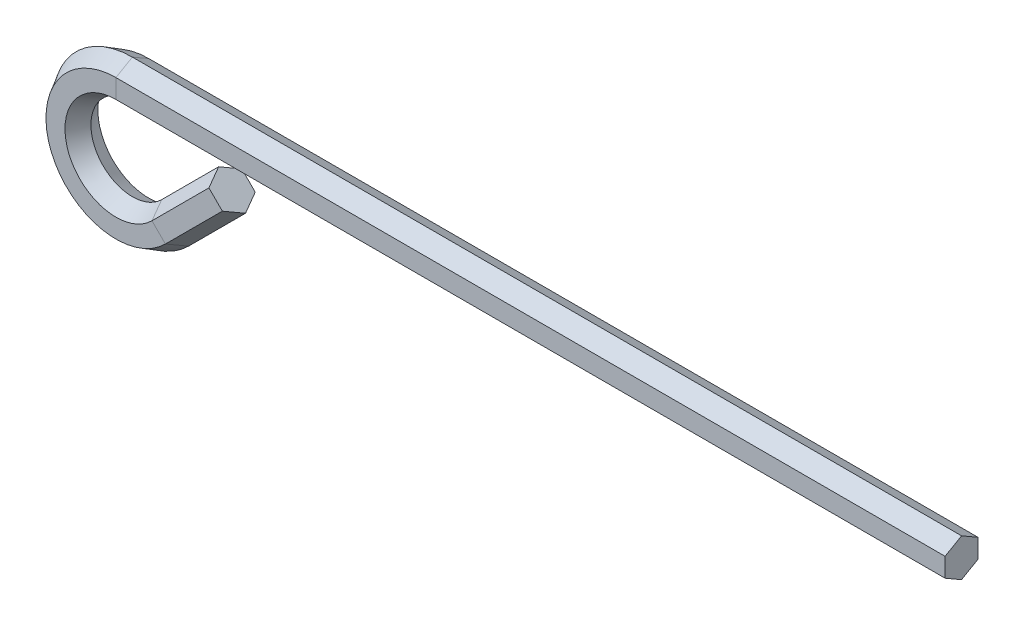
ISO-10303-21;
HEADER;
FILE_DESCRIPTION(('STEP AP214'),'2;1');
FILE_NAME('part.step','',(''),(''),'','','');
FILE_SCHEMA(('AUTOMOTIVE_DESIGN { 1 0 10303 214 1 1 1 1 }'));
ENDSEC;
DATA;
#1=APPLICATION_CONTEXT('core data for automotive mechanical design processes');
#2=APPLICATION_PROTOCOL_DEFINITION('international standard','automotive_design',2000,#1);
#3=PRODUCT_CONTEXT('',#1,'mechanical');
#4=PRODUCT('Part','Part','',(#3));
#5=PRODUCT_RELATED_PRODUCT_CATEGORY('part','',(#4));
#6=PRODUCT_DEFINITION_FORMATION('','',#4);
#7=PRODUCT_DEFINITION_CONTEXT('part definition',#1,'design');
#8=PRODUCT_DEFINITION('design','',#6,#7);
#9=PRODUCT_DEFINITION_SHAPE('','',#8);
#10=(LENGTH_UNIT() NAMED_UNIT(*) SI_UNIT(.MILLI.,.METRE.));
#11=(NAMED_UNIT(*) PLANE_ANGLE_UNIT() SI_UNIT($,.RADIAN.));
#12=(NAMED_UNIT(*) SI_UNIT($,.STERADIAN.) SOLID_ANGLE_UNIT());
#13=UNCERTAINTY_MEASURE_WITH_UNIT(LENGTH_MEASURE(1.E-05),#10,'distance_accuracy_value','');
#14=(GEOMETRIC_REPRESENTATION_CONTEXT(3) GLOBAL_UNCERTAINTY_ASSIGNED_CONTEXT((#13)) GLOBAL_UNIT_ASSIGNED_CONTEXT((#10,
#11,#12)) REPRESENTATION_CONTEXT('',''));
#15=CARTESIAN_POINT('',(0.,0.,0.));
#16=DIRECTION('',(0.,0.,1.));
#17=DIRECTION('',(1.,0.,0.));
#18=AXIS2_PLACEMENT_3D('',#15,#16,#17);
#19=CARTESIAN_POINT('',(4.12132034355962,4.12132034355964,0.));
#20=DIRECTION('',(-0.707106781186546,-0.707106781186549,0.));
#21=DIRECTION('',(0.,0.,-1.));
#22=AXIS2_PLACEMENT_3D('',#19,#20,#21);
#23=PLANE('',#22);
#24=DIRECTION('',(-0.353553390593274,0.353553390593273,-0.866025403784439));
#25=VECTOR('',#24,1.);
#26=CARTESIAN_POINT('',(6.7286602769165,1.51398041020278,1.1905));
#27=LINE('',#26,#25);
#28=CARTESIAN_POINT('',(6.7286602769165,1.51398041020278,1.1905));
#29=VERTEX_POINT('',#28);
#30=CARTESIAN_POINT('',(6.24264068711927,2.,0.));
#31=VERTEX_POINT('',#30);
#32=EDGE_CURVE('E192',#29,#31,#27,.T.);
#33=ORIENTED_EDGE('',*,*,#32,.F.);
#34=DIRECTION('',(-0.707106781186549,0.707106781186546,0.));
#35=VECTOR('',#34,1.);
#36=CARTESIAN_POINT('',(7.70069945651096,0.541941230608321,1.1905));
#37=LINE('',#36,#35);
#38=CARTESIAN_POINT('',(7.70069945651096,0.541941230608321,1.1905));
#39=VERTEX_POINT('',#38);
#40=EDGE_CURVE('E234',#39,#29,#37,.T.);
#41=ORIENTED_EDGE('',*,*,#40,.F.);
#42=DIRECTION('',(-0.353553390593275,0.353553390593273,0.866025403784438));
#43=VECTOR('',#42,1.);
#44=CARTESIAN_POINT('',(8.18671904630819,0.0559216408110921,0.));
#45=LINE('',#44,#43);
#46=CARTESIAN_POINT('',(8.18671904630819,0.0559216408110921,0.));
#47=VERTEX_POINT('',#46);
#48=EDGE_CURVE('E221',#47,#39,#45,.T.);
#49=ORIENTED_EDGE('',*,*,#48,.F.);
#50=DIRECTION('',(0.353553390593275,-0.353553390593273,0.866025403784439));
#51=VECTOR('',#50,1.);
#52=CARTESIAN_POINT('',(7.70069945651096,0.541941230608321,-1.1905));
#53=LINE('',#52,#51);
#54=CARTESIAN_POINT('',(7.70069945651096,0.541941230608321,-1.1905));
#55=VERTEX_POINT('',#54);
#56=EDGE_CURVE('E144',#55,#47,#53,.T.);
#57=ORIENTED_EDGE('',*,*,#56,.F.);
#58=DIRECTION('',(0.707106781186549,-0.707106781186546,0.));
#59=VECTOR('',#58,1.);
#60=CARTESIAN_POINT('',(6.7286602769165,1.51398041020277,-1.1905));
#61=LINE('',#60,#59);
#62=CARTESIAN_POINT('',(6.7286602769165,1.51398041020277,-1.1905));
#63=VERTEX_POINT('',#62);
#64=EDGE_CURVE('E148',#63,#55,#61,.T.);
#65=ORIENTED_EDGE('',*,*,#64,.F.);
#66=DIRECTION('',(0.353553390593275,-0.353553390593274,-0.866025403784438));
#67=VECTOR('',#66,1.);
#68=CARTESIAN_POINT('',(6.24264068711927,2.,0.));
#69=LINE('',#68,#67);
#70=EDGE_CURVE('E153',#31,#63,#69,.T.);
#71=ORIENTED_EDGE('',*,*,#70,.F.);
#72=EDGE_LOOP('',(#33,#41,#49,#57,#65,#71));
#73=FACE_BOUND('',#72,.T.);
#74=ADVANCED_FACE('F43',(#73),#23,.F.);
#75=CARTESIAN_POINT('',(60.,0.,0.));
#76=DIRECTION('',(1.,0.,0.));
#77=DIRECTION('',(0.,0.,-1.));
#78=AXIS2_PLACEMENT_3D('',#75,#76,#77);
#79=PLANE('',#78);
#80=DIRECTION('',(0.,-0.5,-0.866025403784439));
#81=VECTOR('',#80,1.);
#82=CARTESIAN_POINT('',(60.,3.68733549547025,1.1905));
#83=LINE('',#82,#81);
#84=CARTESIAN_POINT('',(60.,3.68733549547025,1.1905));
#85=VERTEX_POINT('',#84);
#86=CARTESIAN_POINT('',(60.,3.,0.));
#87=VERTEX_POINT('',#86);
#88=EDGE_CURVE('E164',#85,#87,#83,.T.);
#89=ORIENTED_EDGE('',*,*,#88,.T.);
#90=DIRECTION('',(0.,0.500000000000001,-0.866025403784438));
#91=VECTOR('',#90,1.);
#92=CARTESIAN_POINT('',(60.,3.,0.));
#93=LINE('',#92,#91);
#94=CARTESIAN_POINT('',(60.,3.68733549547025,-1.1905));
#95=VERTEX_POINT('',#94);
#96=EDGE_CURVE('E167',#87,#95,#93,.T.);
#97=ORIENTED_EDGE('',*,*,#96,.T.);
#98=DIRECTION('',(0.,1.,0.));
#99=VECTOR('',#98,1.);
#100=CARTESIAN_POINT('',(60.,3.68733549547025,-1.1905));
#101=LINE('',#100,#99);
#102=CARTESIAN_POINT('',(60.,5.06200648641075,-1.1905));
#103=VERTEX_POINT('',#102);
#104=EDGE_CURVE('E207',#95,#103,#101,.T.);
#105=ORIENTED_EDGE('',*,*,#104,.T.);
#106=DIRECTION('',(0.,0.5,0.866025403784439));
#107=VECTOR('',#106,1.);
#108=CARTESIAN_POINT('',(60.,5.06200648641075,-1.1905));
#109=LINE('',#108,#107);
#110=CARTESIAN_POINT('',(60.,5.749341981881,0.));
#111=VERTEX_POINT('',#110);
#112=EDGE_CURVE('E62',#103,#111,#109,.T.);
#113=ORIENTED_EDGE('',*,*,#112,.T.);
#114=DIRECTION('',(0.,-0.5,0.866025403784438));
#115=VECTOR('',#114,1.);
#116=CARTESIAN_POINT('',(60.,5.749341981881,0.));
#117=LINE('',#116,#115);
#118=CARTESIAN_POINT('',(60.,5.06200648641075,1.1905));
#119=VERTEX_POINT('',#118);
#120=EDGE_CURVE('E56',#111,#119,#117,.T.);
#121=ORIENTED_EDGE('',*,*,#120,.T.);
#122=DIRECTION('',(0.,-1.,0.));
#123=VECTOR('',#122,1.);
#124=CARTESIAN_POINT('',(60.,5.06200648641075,1.1905));
#125=LINE('',#124,#123);
#126=EDGE_CURVE('E11',#119,#85,#125,.T.);
#127=ORIENTED_EDGE('',*,*,#126,.T.);
#128=EDGE_LOOP('',(#89,#97,#105,#113,#121,#127));
#129=FACE_BOUND('',#128,.T.);
#130=ADVANCED_FACE('F166',(#129),#79,.T.);
#131=CARTESIAN_POINT('',(6.7286602769165,1.51398041020278,1.1905));
#132=DIRECTION('',(-0.612372435695796,0.612372435695794,0.5));
#133=DIRECTION('',(-0.707106781186546,-0.707106781186549,0.));
#134=AXIS2_PLACEMENT_3D('',#131,#132,#133);
#135=PLANE('',#134);
#136=DIRECTION('',(-0.707106781186546,-0.707106781186549,0.));
#137=VECTOR('',#136,1.);
#138=CARTESIAN_POINT('',(6.24264068711927,2.,0.));
#139=LINE('',#138,#137);
#140=CARTESIAN_POINT('',(2.12132034355965,-2.12132034355964,0.));
#141=VERTEX_POINT('',#140);
#142=EDGE_CURVE('E197',#31,#141,#139,.T.);
#143=ORIENTED_EDGE('',*,*,#142,.T.);
#144=DIRECTION('',(-0.353553390593274,0.353553390593273,-0.866025403784439));
#145=VECTOR('',#144,1.);
#146=CARTESIAN_POINT('',(2.60733993335688,-2.60733993335686,1.1905));
#147=LINE('',#146,#145);
#148=CARTESIAN_POINT('',(2.60733993335688,-2.60733993335686,1.1905));
#149=VERTEX_POINT('',#148);
#150=EDGE_CURVE('E266',#149,#141,#147,.T.);
#151=ORIENTED_EDGE('',*,*,#150,.F.);
#152=DIRECTION('',(-0.707106781186546,-0.707106781186549,0.));
#153=VECTOR('',#152,1.);
#154=CARTESIAN_POINT('',(6.7286602769165,1.51398041020278,1.1905));
#155=LINE('',#154,#153);
#156=EDGE_CURVE('E248',#29,#149,#155,.T.);
#157=ORIENTED_EDGE('',*,*,#156,.F.);
#158=ORIENTED_EDGE('',*,*,#32,.T.);
#159=EDGE_LOOP('',(#143,#151,#157,#158));
#160=FACE_BOUND('',#159,.T.);
#161=ADVANCED_FACE('F273',(#160),#135,.T.);
#162=CARTESIAN_POINT('',(6.24264068711927,2.,0.));
#163=DIRECTION('',(-0.612372435695795,0.612372435695793,-0.5));
#164=DIRECTION('',(-0.707106781186546,-0.707106781186549,0.));
#165=AXIS2_PLACEMENT_3D('',#162,#163,#164);
#166=PLANE('',#165);
#167=DIRECTION('',(-0.707106781186546,-0.707106781186549,0.));
#168=VECTOR('',#167,1.);
#169=CARTESIAN_POINT('',(6.7286602769165,1.51398041020277,-1.1905));
#170=LINE('',#169,#168);
#171=CARTESIAN_POINT('',(2.60733993335688,-2.60733993335687,-1.1905));
#172=VERTEX_POINT('',#171);
#173=EDGE_CURVE('E196',#63,#172,#170,.T.);
#174=ORIENTED_EDGE('',*,*,#173,.T.);
#175=DIRECTION('',(0.353553390593275,-0.353553390593274,-0.866025403784438));
#176=VECTOR('',#175,1.);
#177=CARTESIAN_POINT('',(2.12132034355965,-2.12132034355963,0.));
#178=LINE('',#177,#176);
#179=EDGE_CURVE('E193',#141,#172,#178,.T.);
#180=ORIENTED_EDGE('',*,*,#179,.F.);
#181=ORIENTED_EDGE('',*,*,#142,.F.);
#182=ORIENTED_EDGE('',*,*,#70,.T.);
#183=EDGE_LOOP('',(#174,#180,#181,#182));
#184=FACE_BOUND('',#183,.T.);
#185=ADVANCED_FACE('F276',(#184),#166,.T.);
#186=CARTESIAN_POINT('',(6.7286602769165,1.51398041020277,-1.1905));
#187=DIRECTION('',(0.,0.,-1.));
#188=DIRECTION('',(-1.,0.,0.));
#189=AXIS2_PLACEMENT_3D('',#186,#187,#188);
#190=PLANE('',#189);
#191=DIRECTION('',(-0.707106781186546,-0.707106781186549,0.));
#192=VECTOR('',#191,1.);
#193=CARTESIAN_POINT('',(7.70069945651096,0.541941230608321,-1.1905));
#194=LINE('',#193,#192);
#195=CARTESIAN_POINT('',(3.57937911295134,-3.57937911295132,-1.1905));
#196=VERTEX_POINT('',#195);
#197=EDGE_CURVE('E210',#55,#196,#194,.T.);
#198=ORIENTED_EDGE('',*,*,#197,.T.);
#199=DIRECTION('',(0.707106781186549,-0.707106781186546,0.));
#200=VECTOR('',#199,1.);
#201=CARTESIAN_POINT('',(2.60733993335688,-2.60733993335686,-1.1905));
#202=LINE('',#201,#200);
#203=EDGE_CURVE('E200',#172,#196,#202,.T.);
#204=ORIENTED_EDGE('',*,*,#203,.F.);
#205=ORIENTED_EDGE('',*,*,#173,.F.);
#206=ORIENTED_EDGE('',*,*,#64,.T.);
#207=EDGE_LOOP('',(#198,#204,#205,#206));
#208=FACE_BOUND('',#207,.T.);
#209=ADVANCED_FACE('F333',(#208),#190,.T.);
#210=CARTESIAN_POINT('',(7.70069945651096,0.541941230608321,-1.1905));
#211=DIRECTION('',(0.612372435695795,-0.612372435695793,-0.5));
#212=DIRECTION('',(0.707106781186546,0.707106781186549,0.));
#213=AXIS2_PLACEMENT_3D('',#210,#211,#212);
#214=PLANE('',#213);
#215=DIRECTION('',(-0.707106781186546,-0.707106781186549,0.));
#216=VECTOR('',#215,1.);
#217=CARTESIAN_POINT('',(8.18671904630819,0.0559216408110921,0.));
#218=LINE('',#217,#216);
#219=CARTESIAN_POINT('',(4.06539870274857,-4.06539870274855,0.));
#220=VERTEX_POINT('',#219);
#221=EDGE_CURVE('E223',#47,#220,#218,.T.);
#222=ORIENTED_EDGE('',*,*,#221,.T.);
#223=DIRECTION('',(0.353553390593275,-0.353553390593273,0.866025403784439));
#224=VECTOR('',#223,1.);
#225=CARTESIAN_POINT('',(3.57937911295134,-3.57937911295132,-1.1905));
#226=LINE('',#225,#224);
#227=EDGE_CURVE('E213',#196,#220,#226,.T.);
#228=ORIENTED_EDGE('',*,*,#227,.F.);
#229=ORIENTED_EDGE('',*,*,#197,.F.);
#230=ORIENTED_EDGE('',*,*,#56,.T.);
#231=EDGE_LOOP('',(#222,#228,#229,#230));
#232=FACE_BOUND('',#231,.T.);
#233=ADVANCED_FACE('F342',(#232),#214,.T.);
#234=CARTESIAN_POINT('',(8.18671904630819,0.0559216408110921,0.));
#235=DIRECTION('',(0.612372435695795,-0.612372435695793,0.5));
#236=DIRECTION('',(0.707106781186546,0.707106781186549,0.));
#237=AXIS2_PLACEMENT_3D('',#234,#235,#236);
#238=PLANE('',#237);
#239=DIRECTION('',(-0.707106781186546,-0.707106781186549,0.));
#240=VECTOR('',#239,1.);
#241=CARTESIAN_POINT('',(7.70069945651096,0.541941230608321,1.1905));
#242=LINE('',#241,#240);
#243=CARTESIAN_POINT('',(3.57937911295134,-3.57937911295132,1.1905));
#244=VERTEX_POINT('',#243);
#245=EDGE_CURVE('E236',#39,#244,#242,.T.);
#246=ORIENTED_EDGE('',*,*,#245,.T.);
#247=DIRECTION('',(-0.353553390593275,0.353553390593273,0.866025403784438));
#248=VECTOR('',#247,1.);
#249=CARTESIAN_POINT('',(4.06539870274857,-4.06539870274854,0.));
#250=LINE('',#249,#248);
#251=EDGE_CURVE('E226',#220,#244,#250,.T.);
#252=ORIENTED_EDGE('',*,*,#251,.F.);
#253=ORIENTED_EDGE('',*,*,#221,.F.);
#254=ORIENTED_EDGE('',*,*,#48,.T.);
#255=EDGE_LOOP('',(#246,#252,#253,#254));
#256=FACE_BOUND('',#255,.T.);
#257=ADVANCED_FACE('F353',(#256),#238,.T.);
#258=CARTESIAN_POINT('',(7.70069945651096,0.541941230608321,1.1905));
#259=DIRECTION('',(0.,0.,1.));
#260=DIRECTION('',(1.,0.,0.));
#261=AXIS2_PLACEMENT_3D('',#258,#259,#260);
#262=PLANE('',#261);
#263=DIRECTION('',(-0.707106781186549,0.707106781186546,0.));
#264=VECTOR('',#263,1.);
#265=CARTESIAN_POINT('',(3.57937911295134,-3.57937911295132,1.1905));
#266=LINE('',#265,#264);
#267=EDGE_CURVE('E239',#244,#149,#266,.T.);
#268=ORIENTED_EDGE('',*,*,#267,.F.);
#269=ORIENTED_EDGE('',*,*,#245,.F.);
#270=ORIENTED_EDGE('',*,*,#40,.T.);
#271=ORIENTED_EDGE('',*,*,#156,.T.);
#272=EDGE_LOOP('',(#268,#269,#270,#271));
#273=FACE_BOUND('',#272,.T.);
#274=ADVANCED_FACE('F289',(#273),#262,.T.);
#275=CARTESIAN_POINT('',(0.,0.,1.1905));
#276=DIRECTION('',(0.,0.,1.));
#277=DIRECTION('',(1.,0.,0.));
#278=AXIS2_PLACEMENT_3D('',#275,#276,#277);
#279=CONICAL_SURFACE('',#278,3.68733549547025,0.523598775598298);
#280=CARTESIAN_POINT('',(0.,0.,0.));
#281=DIRECTION('',(0.,0.,-1.));
#282=DIRECTION('',(0.707106781186549,-0.707106781186546,0.));
#283=AXIS2_PLACEMENT_3D('',#280,#281,#282);
#284=CIRCLE('',#283,3.);
#285=CARTESIAN_POINT('',(0.,3.,0.));
#286=VERTEX_POINT('',#285);
#287=EDGE_CURVE('E203',#141,#286,#284,.T.);
#288=ORIENTED_EDGE('',*,*,#287,.T.);
#289=DIRECTION('',(0.,-0.5,-0.866025403784439));
#290=VECTOR('',#289,1.);
#291=CARTESIAN_POINT('',(0.,3.68733549547024,1.1905));
#292=LINE('',#291,#290);
#293=CARTESIAN_POINT('',(0.,3.68733549547025,1.1905));
#294=VERTEX_POINT('',#293);
#295=EDGE_CURVE('E185',#294,#286,#292,.T.);
#296=ORIENTED_EDGE('',*,*,#295,.F.);
#297=CARTESIAN_POINT('',(0.,0.,1.1905));
#298=DIRECTION('',(0.,0.,-1.));
#299=DIRECTION('',(0.707106781186549,-0.707106781186546,0.));
#300=AXIS2_PLACEMENT_3D('',#297,#298,#299);
#301=CIRCLE('',#300,3.68733549547025);
#302=EDGE_CURVE('E250',#149,#294,#301,.T.);
#303=ORIENTED_EDGE('',*,*,#302,.F.);
#304=ORIENTED_EDGE('',*,*,#150,.T.);
#305=EDGE_LOOP('',(#288,#296,#303,#304));
#306=FACE_BOUND('',#305,.T.);
#307=ADVANCED_FACE('F256',(#306),#279,.F.);
#308=CARTESIAN_POINT('',(0.,0.,0.));
#309=DIRECTION('',(0.,0.,-1.));
#310=DIRECTION('',(-1.,0.,0.));
#311=AXIS2_PLACEMENT_3D('',#308,#309,#310);
#312=CONICAL_SURFACE('',#311,3.,0.523598775598299);
#313=CARTESIAN_POINT('',(0.,0.,-1.1905));
#314=DIRECTION('',(0.,0.,-1.));
#315=DIRECTION('',(0.707106781186549,-0.707106781186546,0.));
#316=AXIS2_PLACEMENT_3D('',#313,#314,#315);
#317=CIRCLE('',#316,3.68733549547025);
#318=CARTESIAN_POINT('',(0.,3.68733549547025,-1.1905));
#319=VERTEX_POINT('',#318);
#320=EDGE_CURVE('E131',#172,#319,#317,.T.);
#321=ORIENTED_EDGE('',*,*,#320,.T.);
#322=DIRECTION('',(0.,0.500000000000001,-0.866025403784438));
#323=VECTOR('',#322,1.);
#324=CARTESIAN_POINT('',(0.,2.99999999999999,0.));
#325=LINE('',#324,#323);
#326=EDGE_CURVE('E201',#286,#319,#325,.T.);
#327=ORIENTED_EDGE('',*,*,#326,.F.);
#328=ORIENTED_EDGE('',*,*,#287,.F.);
#329=ORIENTED_EDGE('',*,*,#179,.T.);
#330=EDGE_LOOP('',(#321,#327,#328,#329));
#331=FACE_BOUND('',#330,.T.);
#332=ADVANCED_FACE('F279',(#331),#312,.F.);
#333=CARTESIAN_POINT('',(2.60733993335688,-2.60733993335686,-1.1905));
#334=DIRECTION('',(0.,0.,-1.));
#335=DIRECTION('',(-1.,0.,0.));
#336=AXIS2_PLACEMENT_3D('',#333,#334,#335);
#337=PLANE('',#336);
#338=CARTESIAN_POINT('',(0.,0.,-1.1905));
#339=DIRECTION('',(0.,0.,-1.));
#340=DIRECTION('',(0.707106781186549,-0.707106781186546,0.));
#341=AXIS2_PLACEMENT_3D('',#338,#339,#340);
#342=CIRCLE('',#341,5.06200648641075);
#343=CARTESIAN_POINT('',(0.,5.06200648641075,-1.1905));
#344=VERTEX_POINT('',#343);
#345=EDGE_CURVE('E122',#196,#344,#342,.T.);
#346=ORIENTED_EDGE('',*,*,#345,.T.);
#347=DIRECTION('',(0.,1.,0.));
#348=VECTOR('',#347,1.);
#349=CARTESIAN_POINT('',(0.,3.68733549547024,-1.1905));
#350=LINE('',#349,#348);
#351=EDGE_CURVE('E204',#319,#344,#350,.T.);
#352=ORIENTED_EDGE('',*,*,#351,.F.);
#353=ORIENTED_EDGE('',*,*,#320,.F.);
#354=ORIENTED_EDGE('',*,*,#203,.T.);
#355=EDGE_LOOP('',(#346,#352,#353,#354));
#356=FACE_BOUND('',#355,.T.);
#357=ADVANCED_FACE('F281',(#356),#337,.T.);
#358=CARTESIAN_POINT('',(0.,0.,-1.1905));
#359=DIRECTION('',(0.,0.,1.));
#360=DIRECTION('',(1.,0.,0.));
#361=AXIS2_PLACEMENT_3D('',#358,#359,#360);
#362=CONICAL_SURFACE('',#361,5.06200648641075,0.523598775598299);
#363=CARTESIAN_POINT('',(0.,0.,0.));
#364=DIRECTION('',(0.,0.,-1.));
#365=DIRECTION('',(0.707106781186549,-0.707106781186546,0.));
#366=AXIS2_PLACEMENT_3D('',#363,#364,#365);
#367=CIRCLE('',#366,5.749341981881);
#368=CARTESIAN_POINT('',(0.,5.749341981881,0.));
#369=VERTEX_POINT('',#368);
#370=EDGE_CURVE('E115',#220,#369,#367,.T.);
#371=ORIENTED_EDGE('',*,*,#370,.T.);
#372=DIRECTION('',(0.,0.5,0.866025403784439));
#373=VECTOR('',#372,1.);
#374=CARTESIAN_POINT('',(0.,5.06200648641074,-1.1905));
#375=LINE('',#374,#373);
#376=EDGE_CURVE('E217',#344,#369,#375,.T.);
#377=ORIENTED_EDGE('',*,*,#376,.F.);
#378=ORIENTED_EDGE('',*,*,#345,.F.);
#379=ORIENTED_EDGE('',*,*,#227,.T.);
#380=EDGE_LOOP('',(#371,#377,#378,#379));
#381=FACE_BOUND('',#380,.T.);
#382=ADVANCED_FACE('F287',(#381),#362,.T.);
#383=CARTESIAN_POINT('',(0.,0.,0.));
#384=DIRECTION('',(0.,0.,-1.));
#385=DIRECTION('',(-1.,0.,0.));
#386=AXIS2_PLACEMENT_3D('',#383,#384,#385);
#387=CONICAL_SURFACE('',#386,5.749341981881,0.523598775598299);
#388=CARTESIAN_POINT('',(0.,0.,1.1905));
#389=DIRECTION('',(0.,0.,-1.));
#390=DIRECTION('',(0.707106781186549,-0.707106781186546,0.));
#391=AXIS2_PLACEMENT_3D('',#388,#389,#390);
#392=CIRCLE('',#391,5.06200648641075);
#393=CARTESIAN_POINT('',(0.,5.06200648641075,1.1905));
#394=VERTEX_POINT('',#393);
#395=EDGE_CURVE('E241',#244,#394,#392,.T.);
#396=ORIENTED_EDGE('',*,*,#395,.T.);
#397=DIRECTION('',(0.,-0.5,0.866025403784438));
#398=VECTOR('',#397,1.);
#399=CARTESIAN_POINT('',(0.,5.74934198188099,0.));
#400=LINE('',#399,#398);
#401=EDGE_CURVE('E229',#369,#394,#400,.T.);
#402=ORIENTED_EDGE('',*,*,#401,.F.);
#403=ORIENTED_EDGE('',*,*,#370,.F.);
#404=ORIENTED_EDGE('',*,*,#251,.T.);
#405=EDGE_LOOP('',(#396,#402,#403,#404));
#406=FACE_BOUND('',#405,.T.);
#407=ADVANCED_FACE('F402',(#406),#387,.T.);
#408=CARTESIAN_POINT('',(3.57937911295134,-3.57937911295132,1.1905));
#409=DIRECTION('',(0.,0.,1.));
#410=DIRECTION('',(1.,0.,0.));
#411=AXIS2_PLACEMENT_3D('',#408,#409,#410);
#412=PLANE('',#411);
#413=DIRECTION('',(0.,-1.,0.));
#414=VECTOR('',#413,1.);
#415=CARTESIAN_POINT('',(0.,5.06200648641074,1.1905));
#416=LINE('',#415,#414);
#417=EDGE_CURVE('E190',#394,#294,#416,.T.);
#418=ORIENTED_EDGE('',*,*,#417,.F.);
#419=ORIENTED_EDGE('',*,*,#395,.F.);
#420=ORIENTED_EDGE('',*,*,#267,.T.);
#421=ORIENTED_EDGE('',*,*,#302,.T.);
#422=EDGE_LOOP('',(#418,#419,#420,#421));
#423=FACE_BOUND('',#422,.T.);
#424=ADVANCED_FACE('F259',(#423),#412,.T.);
#425=CARTESIAN_POINT('',(0.,3.68733549547025,1.1905));
#426=DIRECTION('',(0.,-0.866025403784439,0.5));
#427=DIRECTION('',(0.,-0.5,-0.866025403784439));
#428=AXIS2_PLACEMENT_3D('',#425,#426,#427);
#429=PLANE('',#428);
#430=DIRECTION('',(1.,0.,0.));
#431=VECTOR('',#430,1.);
#432=CARTESIAN_POINT('',(0.,3.,0.));
#433=LINE('',#432,#431);
#434=EDGE_CURVE('E172',#286,#87,#433,.T.);
#435=ORIENTED_EDGE('',*,*,#434,.T.);
#436=ORIENTED_EDGE('',*,*,#88,.F.);
#437=DIRECTION('',(1.,0.,0.));
#438=VECTOR('',#437,1.);
#439=CARTESIAN_POINT('',(0.,3.68733549547025,1.1905));
#440=LINE('',#439,#438);
#441=EDGE_CURVE('E173',#294,#85,#440,.T.);
#442=ORIENTED_EDGE('',*,*,#441,.F.);
#443=ORIENTED_EDGE('',*,*,#295,.T.);
#444=EDGE_LOOP('',(#435,#436,#442,#443));
#445=FACE_BOUND('',#444,.T.);
#446=ADVANCED_FACE('F183',(#445),#429,.T.);
#447=CARTESIAN_POINT('',(0.,3.,0.));
#448=DIRECTION('',(0.,-0.866025403784438,-0.500000000000001));
#449=DIRECTION('',(0.,0.500000000000001,-0.866025403784438));
#450=AXIS2_PLACEMENT_3D('',#447,#448,#449);
#451=PLANE('',#450);
#452=DIRECTION('',(1.,0.,0.));
#453=VECTOR('',#452,1.);
#454=CARTESIAN_POINT('',(0.,3.68733549547025,-1.1905));
#455=LINE('',#454,#453);
#456=EDGE_CURVE('E180',#319,#95,#455,.T.);
#457=ORIENTED_EDGE('',*,*,#456,.T.);
#458=ORIENTED_EDGE('',*,*,#96,.F.);
#459=ORIENTED_EDGE('',*,*,#434,.F.);
#460=ORIENTED_EDGE('',*,*,#326,.T.);
#461=EDGE_LOOP('',(#457,#458,#459,#460));
#462=FACE_BOUND('',#461,.T.);
#463=ADVANCED_FACE('F177',(#462),#451,.T.);
#464=CARTESIAN_POINT('',(0.,3.68733549547025,-1.1905));
#465=DIRECTION('',(0.,0.,-1.));
#466=DIRECTION('',(0.,1.,0.));
#467=AXIS2_PLACEMENT_3D('',#464,#465,#466);
#468=PLANE('',#467);
#469=DIRECTION('',(1.,0.,0.));
#470=VECTOR('',#469,1.);
#471=CARTESIAN_POINT('',(0.,5.06200648641075,-1.1905));
#472=LINE('',#471,#470);
#473=EDGE_CURVE('E100',#344,#103,#472,.T.);
#474=ORIENTED_EDGE('',*,*,#473,.T.);
#475=ORIENTED_EDGE('',*,*,#104,.F.);
#476=ORIENTED_EDGE('',*,*,#456,.F.);
#477=ORIENTED_EDGE('',*,*,#351,.T.);
#478=EDGE_LOOP('',(#474,#475,#476,#477));
#479=FACE_BOUND('',#478,.T.);
#480=ADVANCED_FACE('F438',(#479),#468,.T.);
#481=CARTESIAN_POINT('',(0.,5.06200648641075,-1.1905));
#482=DIRECTION('',(0.,0.866025403784439,-0.5));
#483=DIRECTION('',(0.,0.5,0.866025403784439));
#484=AXIS2_PLACEMENT_3D('',#481,#482,#483);
#485=PLANE('',#484);
#486=DIRECTION('',(1.,0.,0.));
#487=VECTOR('',#486,1.);
#488=CARTESIAN_POINT('',(0.,5.749341981881,0.));
#489=LINE('',#488,#487);
#490=EDGE_CURVE('E92',#369,#111,#489,.T.);
#491=ORIENTED_EDGE('',*,*,#490,.T.);
#492=ORIENTED_EDGE('',*,*,#112,.F.);
#493=ORIENTED_EDGE('',*,*,#473,.F.);
#494=ORIENTED_EDGE('',*,*,#376,.T.);
#495=EDGE_LOOP('',(#491,#492,#493,#494));
#496=FACE_BOUND('',#495,.T.);
#497=ADVANCED_FACE('F299',(#496),#485,.T.);
#498=CARTESIAN_POINT('',(0.,5.749341981881,0.));
#499=DIRECTION('',(0.,0.866025403784438,0.5));
#500=DIRECTION('',(0.,-0.5,0.866025403784438));
#501=AXIS2_PLACEMENT_3D('',#498,#499,#500);
#502=PLANE('',#501);
#503=DIRECTION('',(1.,0.,0.));
#504=VECTOR('',#503,1.);
#505=CARTESIAN_POINT('',(0.,5.06200648641075,1.1905));
#506=LINE('',#505,#504);
#507=EDGE_CURVE('E50',#394,#119,#506,.T.);
#508=ORIENTED_EDGE('',*,*,#507,.T.);
#509=ORIENTED_EDGE('',*,*,#120,.F.);
#510=ORIENTED_EDGE('',*,*,#490,.F.);
#511=ORIENTED_EDGE('',*,*,#401,.T.);
#512=EDGE_LOOP('',(#508,#509,#510,#511));
#513=FACE_BOUND('',#512,.T.);
#514=ADVANCED_FACE('F294',(#513),#502,.T.);
#515=CARTESIAN_POINT('',(0.,5.06200648641075,1.1905));
#516=DIRECTION('',(0.,0.,1.));
#517=DIRECTION('',(0.,-1.,0.));
#518=AXIS2_PLACEMENT_3D('',#515,#516,#517);
#519=PLANE('',#518);
#520=ORIENTED_EDGE('',*,*,#126,.F.);
#521=ORIENTED_EDGE('',*,*,#507,.F.);
#522=ORIENTED_EDGE('',*,*,#417,.T.);
#523=ORIENTED_EDGE('',*,*,#441,.T.);
#524=EDGE_LOOP('',(#520,#521,#522,#523));
#525=FACE_BOUND('',#524,.T.);
#526=ADVANCED_FACE('F251',(#525),#519,.T.);
#527=CLOSED_SHELL('',(#74,#130,#161,#185,#209,#233,#257,#274,#307,#332,#357,#382,#407,#424,#446,
#463,#480,#497,#514,#526));
#528=MANIFOLD_SOLID_BREP('B2',#527);
#529=ADVANCED_BREP_SHAPE_REPRESENTATION('',(#18,#528),#14);
#530=SHAPE_DEFINITION_REPRESENTATION(#9,#529);
ENDSEC;
END-ISO-10303-21;
